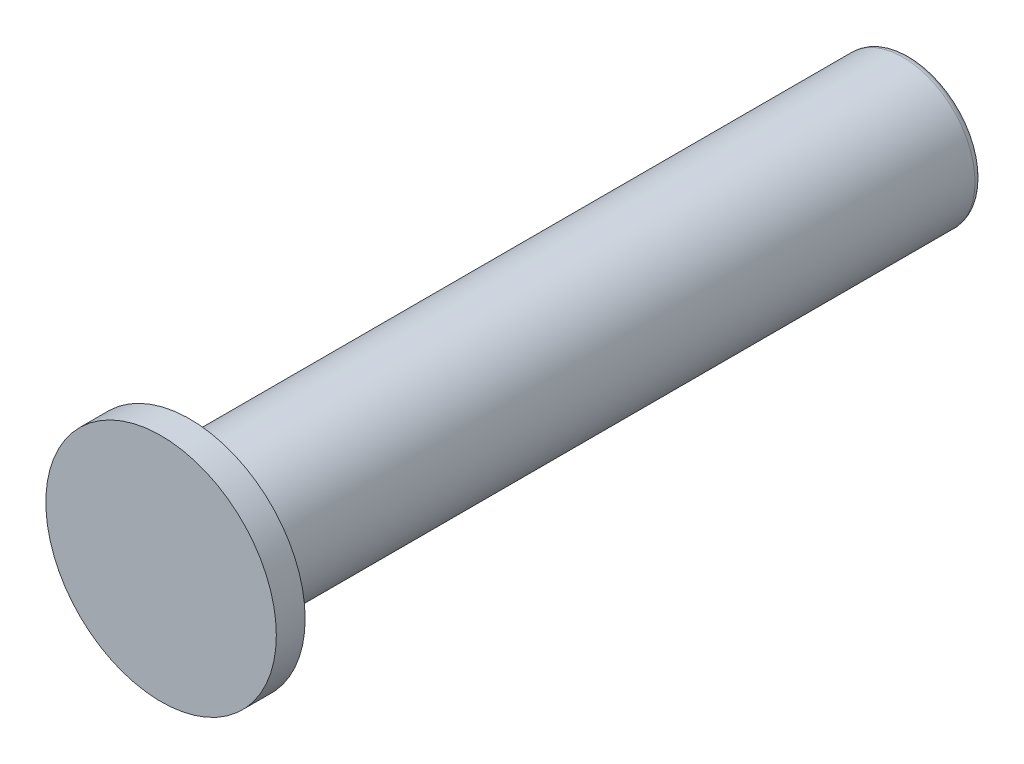
ISO-10303-21;
HEADER;
FILE_DESCRIPTION(('STEP AP214'),'2;1');
FILE_NAME('part.step','',(''),(''),'','','');
FILE_SCHEMA(('AUTOMOTIVE_DESIGN { 1 0 10303 214 1 1 1 1 }'));
ENDSEC;
DATA;
#1=APPLICATION_CONTEXT('core data for automotive mechanical design processes');
#2=APPLICATION_PROTOCOL_DEFINITION('international standard','automotive_design',2000,#1);
#3=PRODUCT_CONTEXT('',#1,'mechanical');
#4=PRODUCT('Part','Part','',(#3));
#5=PRODUCT_RELATED_PRODUCT_CATEGORY('part','',(#4));
#6=PRODUCT_DEFINITION_FORMATION('','',#4);
#7=PRODUCT_DEFINITION_CONTEXT('part definition',#1,'design');
#8=PRODUCT_DEFINITION('design','',#6,#7);
#9=PRODUCT_DEFINITION_SHAPE('','',#8);
#10=(LENGTH_UNIT() NAMED_UNIT(*) SI_UNIT(.MILLI.,.METRE.));
#11=(NAMED_UNIT(*) PLANE_ANGLE_UNIT() SI_UNIT($,.RADIAN.));
#12=(NAMED_UNIT(*) SI_UNIT($,.STERADIAN.) SOLID_ANGLE_UNIT());
#13=UNCERTAINTY_MEASURE_WITH_UNIT(LENGTH_MEASURE(1.E-05),#10,'distance_accuracy_value','');
#14=(GEOMETRIC_REPRESENTATION_CONTEXT(3) GLOBAL_UNCERTAINTY_ASSIGNED_CONTEXT((#13)) GLOBAL_UNIT_ASSIGNED_CONTEXT((#10,
#11,#12)) REPRESENTATION_CONTEXT('',''));
#15=CARTESIAN_POINT('',(0.,0.,0.));
#16=DIRECTION('',(0.,0.,1.));
#17=DIRECTION('',(1.,0.,0.));
#18=AXIS2_PLACEMENT_3D('',#15,#16,#17);
#19=CARTESIAN_POINT('',(0.,0.,25.));
#20=DIRECTION('',(0.,0.,-1.));
#21=DIRECTION('',(-1.,0.,0.));
#22=AXIS2_PLACEMENT_3D('',#19,#20,#21);
#23=CYLINDRICAL_SURFACE('',#22,5.);
#24=CARTESIAN_POINT('',(0.,0.,-24.5));
#25=DIRECTION('',(0.,0.,1.));
#26=DIRECTION('',(1.,0.,0.));
#27=AXIS2_PLACEMENT_3D('',#24,#25,#26);
#28=CIRCLE('',#27,5.);
#29=CARTESIAN_POINT('',(5.,0.,-24.5));
#30=VERTEX_POINT('',#29);
#31=EDGE_CURVE('E51',#30,#30,#28,.T.);
#32=ORIENTED_EDGE('',*,*,#31,.T.);
#33=EDGE_LOOP('',(#32));
#34=FACE_BOUND('',#33,.T.);
#35=CARTESIAN_POINT('',(0.,0.,25.));
#36=DIRECTION('',(0.,0.,1.));
#37=DIRECTION('',(1.,0.,0.));
#38=AXIS2_PLACEMENT_3D('',#35,#36,#37);
#39=CIRCLE('',#38,5.);
#40=CARTESIAN_POINT('',(5.,0.,25.));
#41=VERTEX_POINT('',#40);
#42=EDGE_CURVE('E57',#41,#41,#39,.T.);
#43=ORIENTED_EDGE('',*,*,#42,.F.);
#44=EDGE_LOOP('',(#43));
#45=FACE_BOUND('',#44,.T.);
#46=ADVANCED_FACE('F43',(#34,#45),#23,.T.);
#47=CARTESIAN_POINT('',(0.,0.,-25.));
#48=DIRECTION('',(0.,0.,1.));
#49=DIRECTION('',(1.,0.,0.));
#50=AXIS2_PLACEMENT_3D('',#47,#48,#49);
#51=PLANE('',#50);
#52=CARTESIAN_POINT('',(0.,0.,-25.));
#53=DIRECTION('',(0.,0.,1.));
#54=DIRECTION('',(1.,0.,0.));
#55=AXIS2_PLACEMENT_3D('',#52,#53,#54);
#56=CIRCLE('',#55,4.5);
#57=CARTESIAN_POINT('',(4.5,0.,-25.));
#58=VERTEX_POINT('',#57);
#59=EDGE_CURVE('E10',#58,#58,#56,.F.);
#60=ORIENTED_EDGE('',*,*,#59,.T.);
#61=EDGE_LOOP('',(#60));
#62=FACE_BOUND('',#61,.T.);
#63=ADVANCED_FACE('F90',(#62),#51,.F.);
#64=CARTESIAN_POINT('',(0.,0.,-24.5));
#65=DIRECTION('',(0.,0.,1.));
#66=DIRECTION('',(1.,0.,0.));
#67=AXIS2_PLACEMENT_3D('',#64,#65,#66);
#68=TOROIDAL_SURFACE('',#67,4.5,0.5);
#69=ORIENTED_EDGE('',*,*,#59,.F.);
#70=EDGE_LOOP('',(#69));
#71=FACE_BOUND('',#70,.T.);
#72=ORIENTED_EDGE('',*,*,#31,.F.);
#73=EDGE_LOOP('',(#72));
#74=FACE_BOUND('',#73,.T.);
#75=ADVANCED_FACE('F44',(#71,#74),#68,.T.);
#76=CARTESIAN_POINT('',(0.,0.,27.));
#77=DIRECTION('',(0.,0.,-1.));
#78=DIRECTION('',(-1.,0.,0.));
#79=AXIS2_PLACEMENT_3D('',#76,#77,#78);
#80=CYLINDRICAL_SURFACE('',#79,8.);
#81=CARTESIAN_POINT('',(0.,0.,27.));
#82=DIRECTION('',(0.,0.,1.));
#83=DIRECTION('',(1.,0.,0.));
#84=AXIS2_PLACEMENT_3D('',#81,#82,#83);
#85=CIRCLE('',#84,8.);
#86=CARTESIAN_POINT('',(8.,0.,27.));
#87=VERTEX_POINT('',#86);
#88=EDGE_CURVE('E61',#87,#87,#85,.T.);
#89=ORIENTED_EDGE('',*,*,#88,.F.);
#90=EDGE_LOOP('',(#89));
#91=FACE_BOUND('',#90,.T.);
#92=CARTESIAN_POINT('',(0.,0.,25.));
#93=DIRECTION('',(0.,0.,1.));
#94=DIRECTION('',(1.,0.,0.));
#95=AXIS2_PLACEMENT_3D('',#92,#93,#94);
#96=CIRCLE('',#95,8.);
#97=CARTESIAN_POINT('',(8.,0.,25.));
#98=VERTEX_POINT('',#97);
#99=EDGE_CURVE('E63',#98,#98,#96,.T.);
#100=ORIENTED_EDGE('',*,*,#99,.T.);
#101=EDGE_LOOP('',(#100));
#102=FACE_BOUND('',#101,.T.);
#103=ADVANCED_FACE('F74',(#91,#102),#80,.T.);
#104=CARTESIAN_POINT('',(0.,0.,27.));
#105=DIRECTION('',(0.,0.,1.));
#106=DIRECTION('',(1.,0.,0.));
#107=AXIS2_PLACEMENT_3D('',#104,#105,#106);
#108=PLANE('',#107);
#109=ORIENTED_EDGE('',*,*,#88,.T.);
#110=EDGE_LOOP('',(#109));
#111=FACE_BOUND('',#110,.T.);
#112=ADVANCED_FACE('F75',(#111),#108,.T.);
#113=CARTESIAN_POINT('',(0.,0.,25.));
#114=DIRECTION('',(0.,0.,1.));
#115=DIRECTION('',(1.,0.,0.));
#116=AXIS2_PLACEMENT_3D('',#113,#114,#115);
#117=PLANE('',#116);
#118=ORIENTED_EDGE('',*,*,#42,.T.);
#119=EDGE_LOOP('',(#118));
#120=FACE_BOUND('',#119,.T.);
#121=ORIENTED_EDGE('',*,*,#99,.F.);
#122=EDGE_LOOP('',(#121));
#123=FACE_BOUND('',#122,.T.);
#124=ADVANCED_FACE('F79',(#120,#123),#117,.F.);
#125=CLOSED_SHELL('',(#46,#63,#75,#103,#112,#124));
#126=MANIFOLD_SOLID_BREP('B2',#125);
#127=ADVANCED_BREP_SHAPE_REPRESENTATION('',(#18,#126),#14);
#128=SHAPE_DEFINITION_REPRESENTATION(#9,#127);
ENDSEC;
END-ISO-10303-21;
